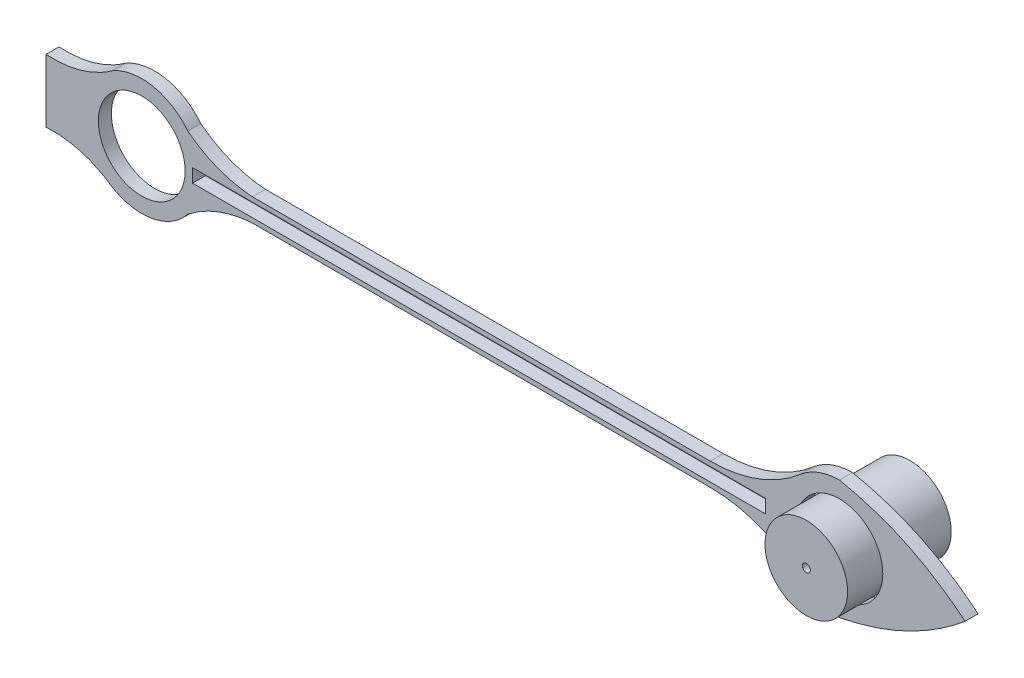
ISO-10303-21;
HEADER;
FILE_DESCRIPTION(('STEP AP214'),'2;1');
FILE_NAME('part.step','',(''),(''),'','','');
FILE_SCHEMA(('AUTOMOTIVE_DESIGN { 1 0 10303 214 1 1 1 1 }'));
ENDSEC;
DATA;
#1=APPLICATION_CONTEXT('core data for automotive mechanical design processes');
#2=APPLICATION_PROTOCOL_DEFINITION('international standard','automotive_design',2000,#1);
#3=PRODUCT_CONTEXT('',#1,'mechanical');
#4=PRODUCT('Part','Part','',(#3));
#5=PRODUCT_RELATED_PRODUCT_CATEGORY('part','',(#4));
#6=PRODUCT_DEFINITION_FORMATION('','',#4);
#7=PRODUCT_DEFINITION_CONTEXT('part definition',#1,'design');
#8=PRODUCT_DEFINITION('design','',#6,#7);
#9=PRODUCT_DEFINITION_SHAPE('','',#8);
#10=(LENGTH_UNIT() NAMED_UNIT(*) SI_UNIT(.MILLI.,.METRE.));
#11=(NAMED_UNIT(*) PLANE_ANGLE_UNIT() SI_UNIT($,.RADIAN.));
#12=(NAMED_UNIT(*) SI_UNIT($,.STERADIAN.) SOLID_ANGLE_UNIT());
#13=UNCERTAINTY_MEASURE_WITH_UNIT(LENGTH_MEASURE(1.E-05),#10,'distance_accuracy_value','');
#14=(GEOMETRIC_REPRESENTATION_CONTEXT(3) GLOBAL_UNCERTAINTY_ASSIGNED_CONTEXT((#13)) GLOBAL_UNIT_ASSIGNED_CONTEXT((#10,
#11,#12)) REPRESENTATION_CONTEXT('',''));
#15=CARTESIAN_POINT('',(0.,0.,0.));
#16=DIRECTION('',(0.,0.,1.));
#17=DIRECTION('',(1.,0.,0.));
#18=AXIS2_PLACEMENT_3D('',#15,#16,#17);
#19=CARTESIAN_POINT('',(10.3411944264889,-0.157435194287058,-0.015));
#20=DIRECTION('',(0.,0.,1.));
#21=DIRECTION('',(1.,0.,0.));
#22=AXIS2_PLACEMENT_3D('',#19,#20,#21);
#23=CYLINDRICAL_SURFACE('',#22,0.571329138616431);
#24=CARTESIAN_POINT('',(10.3411944264889,-0.157435194287058,0.638));
#25=DIRECTION('',(0.,0.,1.));
#26=DIRECTION('',(1.,0.,0.));
#27=AXIS2_PLACEMENT_3D('',#24,#25,#26);
#28=CIRCLE('',#27,0.571329138616431);
#29=CARTESIAN_POINT('',(10.9125235651053,-0.157435194287058,0.638));
#30=VERTEX_POINT('',#29);
#31=EDGE_CURVE('E55',#30,#30,#28,.T.);
#32=ORIENTED_EDGE('',*,*,#31,.F.);
#33=EDGE_LOOP('',(#32));
#34=FACE_BOUND('',#33,.T.);
#35=CARTESIAN_POINT('',(10.3411944264889,-0.157435194287058,-0.795));
#36=DIRECTION('',(0.,0.,-1.));
#37=DIRECTION('',(-1.,0.,0.));
#38=AXIS2_PLACEMENT_3D('',#35,#36,#37);
#39=CIRCLE('',#38,0.571329138616431);
#40=CARTESIAN_POINT('',(9.76986528787246,-0.157435194287058,-0.795));
#41=VERTEX_POINT('',#40);
#42=EDGE_CURVE('E63',#41,#41,#39,.T.);
#43=ORIENTED_EDGE('',*,*,#42,.F.);
#44=EDGE_LOOP('',(#43));
#45=FACE_BOUND('',#44,.T.);
#46=ADVANCED_FACE('F49',(#34,#45),#23,.T.);
#47=CARTESIAN_POINT('',(10.3411944264889,-0.157435194287058,-0.015));
#48=DIRECTION('',(0.,0.,1.));
#49=DIRECTION('',(1.,0.,0.));
#50=AXIS2_PLACEMENT_3D('',#47,#48,#49);
#51=PLANE('',#50);
#52=CARTESIAN_POINT('',(10.3411944264889,-0.157435194287058,-0.015));
#53=DIRECTION('',(0.,0.,-1.));
#54=DIRECTION('',(-1.,0.,0.));
#55=AXIS2_PLACEMENT_3D('',#52,#53,#54);
#56=CIRCLE('',#55,0.0821846661214865);
#57=CARTESIAN_POINT('',(10.2590097603674,-0.157435194287058,-0.015));
#58=VERTEX_POINT('',#57);
#59=EDGE_CURVE('E69',#58,#58,#56,.T.);
#60=ORIENTED_EDGE('',*,*,#59,.T.);
#61=EDGE_LOOP('',(#60));
#62=FACE_BOUND('',#61,.T.);
#63=CARTESIAN_POINT('',(10.3411944264889,-0.157435194287058,-0.015));
#64=DIRECTION('',(0.,0.,1.));
#65=DIRECTION('',(1.,0.,0.));
#66=AXIS2_PLACEMENT_3D('',#63,#64,#65);
#67=CIRCLE('',#66,0.0555002236042479);
#68=CARTESIAN_POINT('',(10.3966946500931,-0.157435194287058,-0.015));
#69=VERTEX_POINT('',#68);
#70=EDGE_CURVE('E11',#69,#69,#67,.T.);
#71=ORIENTED_EDGE('',*,*,#70,.T.);
#72=EDGE_LOOP('',(#71));
#73=FACE_BOUND('',#72,.T.);
#74=ADVANCED_FACE('F91',(#62,#73),#51,.F.);
#75=CARTESIAN_POINT('',(10.3411944264889,-0.157435194287058,-0.015));
#76=DIRECTION('',(0.,0.,1.));
#77=DIRECTION('',(1.,0.,0.));
#78=AXIS2_PLACEMENT_3D('',#75,#76,#77);
#79=CYLINDRICAL_SURFACE('',#78,0.0555002236042479);
#80=ORIENTED_EDGE('',*,*,#70,.F.);
#81=EDGE_LOOP('',(#80));
#82=FACE_BOUND('',#81,.T.);
#83=CARTESIAN_POINT('',(10.3411944264889,-0.157435194287058,0.638));
#84=DIRECTION('',(0.,0.,1.));
#85=DIRECTION('',(1.,0.,0.));
#86=AXIS2_PLACEMENT_3D('',#83,#84,#85);
#87=CIRCLE('',#86,0.0555002236042479);
#88=CARTESIAN_POINT('',(10.3966946500931,-0.157435194287058,0.638));
#89=VERTEX_POINT('',#88);
#90=EDGE_CURVE('E59',#89,#89,#87,.T.);
#91=ORIENTED_EDGE('',*,*,#90,.T.);
#92=EDGE_LOOP('',(#91));
#93=FACE_BOUND('',#92,.T.);
#94=ADVANCED_FACE('F88',(#82,#93),#79,.F.);
#95=CARTESIAN_POINT('',(10.3411944264889,-0.157435194287058,0.638));
#96=DIRECTION('',(0.,0.,1.));
#97=DIRECTION('',(1.,0.,0.));
#98=AXIS2_PLACEMENT_3D('',#95,#96,#97);
#99=PLANE('',#98);
#100=ORIENTED_EDGE('',*,*,#31,.T.);
#101=EDGE_LOOP('',(#100));
#102=FACE_BOUND('',#101,.T.);
#103=ORIENTED_EDGE('',*,*,#90,.F.);
#104=EDGE_LOOP('',(#103));
#105=FACE_BOUND('',#104,.T.);
#106=ADVANCED_FACE('F80',(#102,#105),#99,.T.);
#107=CARTESIAN_POINT('',(10.3411944264889,-0.157435194287058,-0.795));
#108=DIRECTION('',(0.,0.,-1.));
#109=DIRECTION('',(-1.,0.,0.));
#110=AXIS2_PLACEMENT_3D('',#107,#108,#109);
#111=PLANE('',#110);
#112=ORIENTED_EDGE('',*,*,#42,.T.);
#113=EDGE_LOOP('',(#112));
#114=FACE_BOUND('',#113,.T.);
#115=CARTESIAN_POINT('',(10.3411944264889,-0.157435194287058,-0.795));
#116=DIRECTION('',(0.,0.,-1.));
#117=DIRECTION('',(-1.,0.,0.));
#118=AXIS2_PLACEMENT_3D('',#115,#116,#117);
#119=CIRCLE('',#118,0.0821846661214865);
#120=CARTESIAN_POINT('',(10.2590097603674,-0.157435194287058,-0.795));
#121=VERTEX_POINT('',#120);
#122=EDGE_CURVE('E68',#121,#121,#119,.T.);
#123=ORIENTED_EDGE('',*,*,#122,.F.);
#124=EDGE_LOOP('',(#123));
#125=FACE_BOUND('',#124,.T.);
#126=ADVANCED_FACE('F78',(#114,#125),#111,.T.);
#127=CARTESIAN_POINT('',(10.3411944264889,-0.157435194287058,-0.795));
#128=DIRECTION('',(0.,0.,1.));
#129=DIRECTION('',(1.,0.,0.));
#130=AXIS2_PLACEMENT_3D('',#127,#128,#129);
#131=CYLINDRICAL_SURFACE('',#130,0.0821846661214865);
#132=ORIENTED_EDGE('',*,*,#122,.T.);
#133=EDGE_LOOP('',(#132));
#134=FACE_BOUND('',#133,.T.);
#135=ORIENTED_EDGE('',*,*,#59,.F.);
#136=EDGE_LOOP('',(#135));
#137=FACE_BOUND('',#136,.T.);
#138=ADVANCED_FACE('F75',(#134,#137),#131,.F.);
#139=CLOSED_SHELL('',(#46,#74,#94,#106,#126,#138));
#140=MANIFOLD_SOLID_BREP('B2',#139);
#141=CARTESIAN_POINT('',(0.692740720311291,-0.157435194287058,0.18));
#142=DIRECTION('',(0.,0.,-1.));
#143=DIRECTION('',(-1.,0.,0.));
#144=AXIS2_PLACEMENT_3D('',#141,#142,#143);
#145=CYLINDRICAL_SURFACE('',#144,0.808582210206867);
#146=CARTESIAN_POINT('',(0.692740720311291,-0.157435194287058,0.));
#147=DIRECTION('',(0.,0.,1.));
#148=DIRECTION('',(1.,0.,0.));
#149=AXIS2_PLACEMENT_3D('',#146,#147,#148);
#150=CIRCLE('',#149,0.808582210206867);
#151=CARTESIAN_POINT('',(0.292489664377276,-0.860004965118915,0.));
#152=VERTEX_POINT('',#151);
#153=CARTESIAN_POINT('',(1.33084956443728,-0.654046001369646,0.));
#154=VERTEX_POINT('',#153);
#155=EDGE_CURVE('E361',#152,#154,#150,.T.);
#156=ORIENTED_EDGE('',*,*,#155,.T.);
#157=DIRECTION('',(0.,0.,-1.));
#158=VECTOR('',#157,1.);
#159=CARTESIAN_POINT('',(1.33084956443728,-0.654046001369646,0.18));
#160=LINE('',#159,#158);
#161=CARTESIAN_POINT('',(1.33084956443728,-0.654046001369646,0.18));
#162=VERTEX_POINT('',#161);
#163=EDGE_CURVE('E47',#162,#154,#160,.T.);
#164=ORIENTED_EDGE('',*,*,#163,.F.);
#165=CARTESIAN_POINT('',(0.692740720311291,-0.157435194287058,0.18));
#166=DIRECTION('',(0.,0.,1.));
#167=DIRECTION('',(1.,0.,0.));
#168=AXIS2_PLACEMENT_3D('',#165,#166,#167);
#169=CIRCLE('',#168,0.808582210206867);
#170=CARTESIAN_POINT('',(0.292489664377276,-0.860004965118915,0.18));
#171=VERTEX_POINT('',#170);
#172=EDGE_CURVE('E319',#171,#162,#169,.T.);
#173=ORIENTED_EDGE('',*,*,#172,.F.);
#174=DIRECTION('',(0.,0.,-1.));
#175=VECTOR('',#174,1.);
#176=CARTESIAN_POINT('',(0.292489664377276,-0.860004965118915,0.18));
#177=LINE('',#176,#175);
#178=EDGE_CURVE('E433',#171,#152,#177,.T.);
#179=ORIENTED_EDGE('',*,*,#178,.T.);
#180=EDGE_LOOP('',(#156,#164,#173,#179));
#181=FACE_BOUND('',#180,.T.);
#182=ADVANCED_FACE('F144',(#181),#145,.T.);
#183=CARTESIAN_POINT('',(1.33084956443728,-0.654046001369645,0.18));
#184=CARTESIAN_POINT('',(1.72182390763372,-0.349562315111604,0.18));
#185=CARTESIAN_POINT('',(2.22369938661582,-0.314870388574118,0.18));
#186=B_SPLINE_CURVE_WITH_KNOTS('',2,(#183,#184,#185),.UNSPECIFIED.,.F.,.F.,(3,3),(0.,1.),.UNSPECIFIED.);
#187=DIRECTION('',(0.,0.,-1.));
#188=VECTOR('',#187,1.);
#189=SURFACE_OF_LINEAR_EXTRUSION('',#186,#188);
#190=CARTESIAN_POINT('',(1.33084956443728,-0.654046001369645,0.));
#191=CARTESIAN_POINT('',(1.72182390763372,-0.349562315111604,0.));
#192=CARTESIAN_POINT('',(2.22369938661582,-0.314870388574118,0.));
#193=B_SPLINE_CURVE_WITH_KNOTS('',2,(#190,#191,#192),.UNSPECIFIED.,.F.,.F.,(3,3),(0.,1.),.UNSPECIFIED.);
#194=CARTESIAN_POINT('',(2.22369938661582,-0.314870388574117,0.));
#195=VERTEX_POINT('',#194);
#196=EDGE_CURVE('E364',#154,#195,#193,.T.);
#197=ORIENTED_EDGE('',*,*,#196,.T.);
#198=DIRECTION('',(0.,0.,-1.));
#199=VECTOR('',#198,1.);
#200=CARTESIAN_POINT('',(2.22369938661582,-0.314870388574117,0.18));
#201=LINE('',#200,#199);
#202=CARTESIAN_POINT('',(2.22369938661582,-0.314870388574117,0.18));
#203=VERTEX_POINT('',#202);
#204=EDGE_CURVE('E152',#203,#195,#201,.T.);
#205=ORIENTED_EDGE('',*,*,#204,.F.);
#206=EDGE_CURVE('E322',#162,#203,#186,.T.);
#207=ORIENTED_EDGE('',*,*,#206,.F.);
#208=ORIENTED_EDGE('',*,*,#163,.T.);
#209=EDGE_LOOP('',(#197,#205,#207,#208));
#210=FACE_BOUND('',#209,.T.);
#211=ADVANCED_FACE('F333',(#210),#189,.F.);
#212=CARTESIAN_POINT('',(5.75333684182312,-0.314870388574116,0.18));
#213=DIRECTION('',(0.,-1.,0.));
#214=DIRECTION('',(1.,0.,0.));
#215=AXIS2_PLACEMENT_3D('',#212,#213,#214);
#216=PLANE('',#215);
#217=DIRECTION('',(-1.,0.,0.));
#218=VECTOR('',#217,1.);
#219=CARTESIAN_POINT('',(5.75333684182312,-0.314870388574116,0.));
#220=LINE('',#219,#218);
#221=CARTESIAN_POINT('',(8.55584823734783,-0.314870388574115,0.));
#222=VERTEX_POINT('',#221);
#223=EDGE_CURVE('E374',#222,#195,#220,.T.);
#224=ORIENTED_EDGE('',*,*,#223,.F.);
#225=DIRECTION('',(0.,0.,-1.));
#226=VECTOR('',#225,1.);
#227=CARTESIAN_POINT('',(8.55584823734783,-0.314870388574115,0.18));
#228=LINE('',#227,#226);
#229=CARTESIAN_POINT('',(8.55584823734783,-0.314870388574115,0.18));
#230=VERTEX_POINT('',#229);
#231=EDGE_CURVE('E465',#230,#222,#228,.T.);
#232=ORIENTED_EDGE('',*,*,#231,.F.);
#233=DIRECTION('',(-1.,0.,0.));
#234=VECTOR('',#233,1.);
#235=CARTESIAN_POINT('',(5.75333684182312,-0.314870388574116,0.18));
#236=LINE('',#235,#234);
#237=EDGE_CURVE('E327',#230,#203,#236,.T.);
#238=ORIENTED_EDGE('',*,*,#237,.T.);
#239=ORIENTED_EDGE('',*,*,#204,.T.);
#240=EDGE_LOOP('',(#224,#232,#238,#239));
#241=FACE_BOUND('',#240,.T.);
#242=ADVANCED_FACE('F337',(#241),#216,.T.);
#243=CARTESIAN_POINT('',(8.55584823734783,-2.21487038857412,0.18));
#244=DIRECTION('',(0.,0.,-1.));
#245=DIRECTION('',(-1.,0.,0.));
#246=AXIS2_PLACEMENT_3D('',#243,#244,#245);
#247=CYLINDRICAL_SURFACE('',#246,1.9);
#248=CARTESIAN_POINT('',(8.55584823734783,-2.21487038857412,0.));
#249=DIRECTION('',(0.,0.,1.));
#250=DIRECTION('',(1.,0.,0.));
#251=AXIS2_PLACEMENT_3D('',#248,#249,#250);
#252=CIRCLE('',#251,1.9);
#253=CARTESIAN_POINT('',(9.80110652194742,-0.779833174897734,0.));
#254=VERTEX_POINT('',#253);
#255=EDGE_CURVE('E380',#254,#222,#252,.T.);
#256=ORIENTED_EDGE('',*,*,#255,.F.);
#257=DIRECTION('',(0.,0.,-1.));
#258=VECTOR('',#257,1.);
#259=CARTESIAN_POINT('',(9.80110652194742,-0.779833174897734,0.18));
#260=LINE('',#259,#258);
#261=CARTESIAN_POINT('',(9.80110652194742,-0.779833174897734,0.18));
#262=VERTEX_POINT('',#261);
#263=EDGE_CURVE('E463',#262,#254,#260,.T.);
#264=ORIENTED_EDGE('',*,*,#263,.F.);
#265=CARTESIAN_POINT('',(8.55584823734783,-2.21487038857412,0.18));
#266=DIRECTION('',(0.,0.,1.));
#267=DIRECTION('',(1.,0.,0.));
#268=AXIS2_PLACEMENT_3D('',#265,#266,#267);
#269=CIRCLE('',#268,1.9);
#270=EDGE_CURVE('E482',#262,#230,#269,.T.);
#271=ORIENTED_EDGE('',*,*,#270,.T.);
#272=ORIENTED_EDGE('',*,*,#231,.T.);
#273=EDGE_LOOP('',(#256,#264,#271,#272));
#274=FACE_BOUND('',#273,.T.);
#275=ADVANCED_FACE('F478',(#274),#247,.F.);
#276=CARTESIAN_POINT('',(10.3411944264889,-0.157435194287058,0.18));
#277=DIRECTION('',(0.,0.,-1.));
#278=DIRECTION('',(-1.,0.,0.));
#279=AXIS2_PLACEMENT_3D('',#276,#277,#278);
#280=CYLINDRICAL_SURFACE('',#279,0.824059579702972);
#281=CARTESIAN_POINT('',(10.3411944264889,-0.157435194287058,0.));
#282=DIRECTION('',(0.,0.,1.));
#283=DIRECTION('',(1.,0.,0.));
#284=AXIS2_PLACEMENT_3D('',#281,#282,#283);
#285=CIRCLE('',#284,0.824059579702972);
#286=CARTESIAN_POINT('',(10.3411944264889,-0.98149477399003,0.));
#287=VERTEX_POINT('',#286);
#288=EDGE_CURVE('E383',#254,#287,#285,.T.);
#289=ORIENTED_EDGE('',*,*,#288,.T.);
#290=DIRECTION('',(0.,0.,-1.));
#291=VECTOR('',#290,1.);
#292=CARTESIAN_POINT('',(10.3411944264889,-0.98149477399003,0.18));
#293=LINE('',#292,#291);
#294=CARTESIAN_POINT('',(10.3411944264889,-0.98149477399003,0.18));
#295=VERTEX_POINT('',#294);
#296=EDGE_CURVE('E460',#295,#287,#293,.T.);
#297=ORIENTED_EDGE('',*,*,#296,.F.);
#298=CARTESIAN_POINT('',(10.3411944264889,-0.157435194287058,0.18));
#299=DIRECTION('',(0.,0.,1.));
#300=DIRECTION('',(1.,0.,0.));
#301=AXIS2_PLACEMENT_3D('',#298,#299,#300);
#302=CIRCLE('',#301,0.824059579702972);
#303=EDGE_CURVE('E485',#262,#295,#302,.T.);
#304=ORIENTED_EDGE('',*,*,#303,.F.);
#305=ORIENTED_EDGE('',*,*,#263,.T.);
#306=EDGE_LOOP('',(#289,#297,#304,#305));
#307=FACE_BOUND('',#306,.T.);
#308=ADVANCED_FACE('F507',(#307),#280,.T.);
#309=CARTESIAN_POINT('',(10.3411944264889,-0.98149477399003,0.18));
#310=CARTESIAN_POINT('',(11.3300371086183,-0.786660904355301,0.18));
#311=CARTESIAN_POINT('',(12.0777844314337,-0.157435194287059,0.18));
#312=B_SPLINE_CURVE_WITH_KNOTS('',2,(#309,#310,#311),.UNSPECIFIED.,.F.,.F.,(3,3),(0.,1.),.UNSPECIFIED.);
#313=DIRECTION('',(0.,0.,-1.));
#314=VECTOR('',#313,1.);
#315=SURFACE_OF_LINEAR_EXTRUSION('',#312,#314);
#316=CARTESIAN_POINT('',(10.3411944264889,-0.98149477399003,0.));
#317=CARTESIAN_POINT('',(11.3300371086183,-0.786660904355301,0.));
#318=CARTESIAN_POINT('',(12.0777844314337,-0.157435194287059,0.));
#319=B_SPLINE_CURVE_WITH_KNOTS('',2,(#316,#317,#318),.UNSPECIFIED.,.F.,.F.,(3,3),(0.,1.),.UNSPECIFIED.);
#320=CARTESIAN_POINT('',(12.0777844314337,-0.157435194287059,0.));
#321=VERTEX_POINT('',#320);
#322=EDGE_CURVE('E385',#287,#321,#319,.T.);
#323=ORIENTED_EDGE('',*,*,#322,.T.);
#324=DIRECTION('',(0.,0.,-1.));
#325=VECTOR('',#324,1.);
#326=CARTESIAN_POINT('',(12.0777844314337,-0.157435194287059,0.18));
#327=LINE('',#326,#325);
#328=CARTESIAN_POINT('',(12.0777844314337,-0.157435194287059,0.18));
#329=VERTEX_POINT('',#328);
#330=EDGE_CURVE('E458',#329,#321,#327,.T.);
#331=ORIENTED_EDGE('',*,*,#330,.F.);
#332=EDGE_CURVE('E486',#295,#329,#312,.T.);
#333=ORIENTED_EDGE('',*,*,#332,.F.);
#334=ORIENTED_EDGE('',*,*,#296,.T.);
#335=EDGE_LOOP('',(#323,#331,#333,#334));
#336=FACE_BOUND('',#335,.T.);
#337=ADVANCED_FACE('F502',(#336),#315,.F.);
#338=CARTESIAN_POINT('',(10.3411944264889,0.666624385415912,0.18));
#339=CARTESIAN_POINT('',(11.3300371086183,0.471790515781183,0.18));
#340=CARTESIAN_POINT('',(12.0777844314337,-0.157435194287059,0.18));
#341=B_SPLINE_CURVE_WITH_KNOTS('',2,(#338,#339,#340),.UNSPECIFIED.,.F.,.F.,(3,3),(0.,1.),.UNSPECIFIED.);
#342=DIRECTION('',(0.,0.,-1.));
#343=VECTOR('',#342,1.);
#344=SURFACE_OF_LINEAR_EXTRUSION('',#341,#343);
#345=CARTESIAN_POINT('',(10.3411944264889,0.666624385415912,0.));
#346=CARTESIAN_POINT('',(11.3300371086183,0.471790515781183,0.));
#347=CARTESIAN_POINT('',(12.0777844314337,-0.157435194287059,0.));
#348=B_SPLINE_CURVE_WITH_KNOTS('',2,(#345,#346,#347),.UNSPECIFIED.,.F.,.F.,(3,3),(0.,1.),.UNSPECIFIED.);
#349=CARTESIAN_POINT('',(10.3411944264889,0.666624385415914,0.));
#350=VERTEX_POINT('',#349);
#351=EDGE_CURVE('E390',#350,#321,#348,.T.);
#352=ORIENTED_EDGE('',*,*,#351,.F.);
#353=DIRECTION('',(0.,0.,-1.));
#354=VECTOR('',#353,1.);
#355=CARTESIAN_POINT('',(10.3411944264889,0.666624385415914,0.18));
#356=LINE('',#355,#354);
#357=CARTESIAN_POINT('',(10.3411944264889,0.666624385415914,0.18));
#358=VERTEX_POINT('',#357);
#359=EDGE_CURVE('E456',#358,#350,#356,.T.);
#360=ORIENTED_EDGE('',*,*,#359,.F.);
#361=EDGE_CURVE('E493',#358,#329,#341,.T.);
#362=ORIENTED_EDGE('',*,*,#361,.T.);
#363=ORIENTED_EDGE('',*,*,#330,.T.);
#364=EDGE_LOOP('',(#352,#360,#362,#363));
#365=FACE_BOUND('',#364,.T.);
#366=ADVANCED_FACE('F506',(#365),#344,.T.);
#367=CARTESIAN_POINT('',(10.3411944264889,-0.157435194287058,0.18));
#368=DIRECTION('',(0.,0.,-1.));
#369=DIRECTION('',(-1.,0.,0.));
#370=AXIS2_PLACEMENT_3D('',#367,#368,#369);
#371=CYLINDRICAL_SURFACE('',#370,0.824059579702972);
#372=CARTESIAN_POINT('',(10.3411944264889,-0.157435194287058,0.));
#373=DIRECTION('',(0.,0.,1.));
#374=DIRECTION('',(1.,0.,0.));
#375=AXIS2_PLACEMENT_3D('',#372,#373,#374);
#376=CIRCLE('',#375,0.824059579702972);
#377=CARTESIAN_POINT('',(9.80110652194742,0.464962786323618,0.));
#378=VERTEX_POINT('',#377);
#379=EDGE_CURVE('E398',#350,#378,#376,.T.);
#380=ORIENTED_EDGE('',*,*,#379,.T.);
#381=DIRECTION('',(0.,0.,-1.));
#382=VECTOR('',#381,1.);
#383=CARTESIAN_POINT('',(9.80110652194742,0.464962786323618,0.18));
#384=LINE('',#383,#382);
#385=CARTESIAN_POINT('',(9.80110652194742,0.464962786323618,0.18));
#386=VERTEX_POINT('',#385);
#387=EDGE_CURVE('E453',#386,#378,#384,.T.);
#388=ORIENTED_EDGE('',*,*,#387,.F.);
#389=CARTESIAN_POINT('',(10.3411944264889,-0.157435194287058,0.18));
#390=DIRECTION('',(0.,0.,1.));
#391=DIRECTION('',(1.,0.,0.));
#392=AXIS2_PLACEMENT_3D('',#389,#390,#391);
#393=CIRCLE('',#392,0.824059579702972);
#394=EDGE_CURVE('E716',#358,#386,#393,.T.);
#395=ORIENTED_EDGE('',*,*,#394,.F.);
#396=ORIENTED_EDGE('',*,*,#359,.T.);
#397=EDGE_LOOP('',(#380,#388,#395,#396));
#398=FACE_BOUND('',#397,.T.);
#399=ADVANCED_FACE('F554',(#398),#371,.T.);
#400=CARTESIAN_POINT('',(8.55584823734783,1.9,0.18));
#401=DIRECTION('',(0.,0.,-1.));
#402=DIRECTION('',(-1.,0.,0.));
#403=AXIS2_PLACEMENT_3D('',#400,#401,#402);
#404=CYLINDRICAL_SURFACE('',#403,1.9);
#405=CARTESIAN_POINT('',(8.55584823734783,1.9,0.));
#406=DIRECTION('',(0.,0.,1.));
#407=DIRECTION('',(1.,0.,0.));
#408=AXIS2_PLACEMENT_3D('',#405,#406,#407);
#409=CIRCLE('',#408,1.9);
#410=CARTESIAN_POINT('',(8.55584823734783,0.,0.));
#411=VERTEX_POINT('',#410);
#412=EDGE_CURVE('E403',#378,#411,#409,.F.);
#413=ORIENTED_EDGE('',*,*,#412,.T.);
#414=DIRECTION('',(0.,0.,-1.));
#415=VECTOR('',#414,1.);
#416=CARTESIAN_POINT('',(8.55584823734783,0.,0.18));
#417=LINE('',#416,#415);
#418=CARTESIAN_POINT('',(8.55584823734783,0.,0.18));
#419=VERTEX_POINT('',#418);
#420=EDGE_CURVE('E451',#419,#411,#417,.T.);
#421=ORIENTED_EDGE('',*,*,#420,.F.);
#422=CARTESIAN_POINT('',(8.55584823734783,1.9,0.18));
#423=DIRECTION('',(0.,0.,1.));
#424=DIRECTION('',(1.,0.,0.));
#425=AXIS2_PLACEMENT_3D('',#422,#423,#424);
#426=CIRCLE('',#425,1.9);
#427=EDGE_CURVE('E715',#386,#419,#426,.F.);
#428=ORIENTED_EDGE('',*,*,#427,.F.);
#429=ORIENTED_EDGE('',*,*,#387,.T.);
#430=EDGE_LOOP('',(#413,#421,#428,#429));
#431=FACE_BOUND('',#430,.T.);
#432=ADVANCED_FACE('F562',(#431),#404,.F.);
#433=CARTESIAN_POINT('',(5.75333684182312,0.,0.18));
#434=DIRECTION('',(0.,1.,0.));
#435=DIRECTION('',(0.,0.,1.));
#436=AXIS2_PLACEMENT_3D('',#433,#434,#435);
#437=PLANE('',#436);
#438=DIRECTION('',(1.,0.,0.));
#439=VECTOR('',#438,1.);
#440=CARTESIAN_POINT('',(5.75333684182312,0.,0.));
#441=LINE('',#440,#439);
#442=CARTESIAN_POINT('',(2.22369938661582,0.,0.));
#443=VERTEX_POINT('',#442);
#444=EDGE_CURVE('E406',#443,#411,#441,.T.);
#445=ORIENTED_EDGE('',*,*,#444,.F.);
#446=DIRECTION('',(0.,0.,-1.));
#447=VECTOR('',#446,1.);
#448=CARTESIAN_POINT('',(2.22369938661582,0.,0.18));
#449=LINE('',#448,#447);
#450=CARTESIAN_POINT('',(2.22369938661582,0.,0.18));
#451=VERTEX_POINT('',#450);
#452=EDGE_CURVE('E449',#451,#443,#449,.T.);
#453=ORIENTED_EDGE('',*,*,#452,.F.);
#454=DIRECTION('',(1.,0.,0.));
#455=VECTOR('',#454,1.);
#456=CARTESIAN_POINT('',(5.75333684182312,0.,0.18));
#457=LINE('',#456,#455);
#458=EDGE_CURVE('E709',#451,#419,#457,.T.);
#459=ORIENTED_EDGE('',*,*,#458,.T.);
#460=ORIENTED_EDGE('',*,*,#420,.T.);
#461=EDGE_LOOP('',(#445,#453,#459,#460));
#462=FACE_BOUND('',#461,.T.);
#463=ADVANCED_FACE('F570',(#462),#437,.T.);
#464=CARTESIAN_POINT('',(1.33084956443728,0.339175612795525,0.18));
#465=CARTESIAN_POINT('',(1.72182390763372,0.0346919265374838,0.18));
#466=CARTESIAN_POINT('',(2.22369938661582,0.,0.18));
#467=B_SPLINE_CURVE_WITH_KNOTS('',2,(#464,#465,#466),.UNSPECIFIED.,.F.,.F.,(3,3),(0.,1.),.UNSPECIFIED.);
#468=DIRECTION('',(0.,0.,-1.));
#469=VECTOR('',#468,1.);
#470=SURFACE_OF_LINEAR_EXTRUSION('',#467,#469);
#471=CARTESIAN_POINT('',(1.33084956443728,0.339175612795525,0.));
#472=CARTESIAN_POINT('',(1.72182390763372,0.0346919265374838,0.));
#473=CARTESIAN_POINT('',(2.22369938661582,0.,0.));
#474=B_SPLINE_CURVE_WITH_KNOTS('',2,(#471,#472,#473),.UNSPECIFIED.,.F.,.F.,(3,3),(0.,1.),.UNSPECIFIED.);
#475=CARTESIAN_POINT('',(1.33084956443728,0.339175612795527,0.));
#476=VERTEX_POINT('',#475);
#477=EDGE_CURVE('E409',#476,#443,#474,.T.);
#478=ORIENTED_EDGE('',*,*,#477,.F.);
#479=DIRECTION('',(0.,0.,-1.));
#480=VECTOR('',#479,1.);
#481=CARTESIAN_POINT('',(1.33084956443728,0.339175612795527,0.18));
#482=LINE('',#481,#480);
#483=CARTESIAN_POINT('',(1.33084956443728,0.339175612795527,0.18));
#484=VERTEX_POINT('',#483);
#485=EDGE_CURVE('E447',#484,#476,#482,.T.);
#486=ORIENTED_EDGE('',*,*,#485,.F.);
#487=EDGE_CURVE('E703',#484,#451,#467,.T.);
#488=ORIENTED_EDGE('',*,*,#487,.T.);
#489=ORIENTED_EDGE('',*,*,#452,.T.);
#490=EDGE_LOOP('',(#478,#486,#488,#489));
#491=FACE_BOUND('',#490,.T.);
#492=ADVANCED_FACE('F579',(#491),#470,.T.);
#493=CARTESIAN_POINT('',(0.692740720311291,-0.157435194287058,0.18));
#494=DIRECTION('',(0.,0.,-1.));
#495=DIRECTION('',(-1.,0.,0.));
#496=AXIS2_PLACEMENT_3D('',#493,#494,#495);
#497=CYLINDRICAL_SURFACE('',#496,0.808582210206865);
#498=CARTESIAN_POINT('',(0.692740720311291,-0.157435194287058,0.));
#499=DIRECTION('',(0.,0.,1.));
#500=DIRECTION('',(1.,0.,0.));
#501=AXIS2_PLACEMENT_3D('',#498,#499,#500);
#502=CIRCLE('',#501,0.808582210206865);
#503=CARTESIAN_POINT('',(0.292489664377276,0.545134576544797,0.));
#504=VERTEX_POINT('',#503);
#505=EDGE_CURVE('E414',#476,#504,#502,.T.);
#506=ORIENTED_EDGE('',*,*,#505,.T.);
#507=DIRECTION('',(0.,0.,-1.));
#508=VECTOR('',#507,1.);
#509=CARTESIAN_POINT('',(0.292489664377276,0.545134576544797,0.18));
#510=LINE('',#509,#508);
#511=CARTESIAN_POINT('',(0.292489664377276,0.545134576544797,0.18));
#512=VERTEX_POINT('',#511);
#513=EDGE_CURVE('E445',#512,#504,#510,.T.);
#514=ORIENTED_EDGE('',*,*,#513,.F.);
#515=CARTESIAN_POINT('',(0.692740720311291,-0.157435194287058,0.18));
#516=DIRECTION('',(0.,0.,1.));
#517=DIRECTION('',(1.,0.,0.));
#518=AXIS2_PLACEMENT_3D('',#515,#516,#517);
#519=CIRCLE('',#518,0.808582210206865);
#520=EDGE_CURVE('E698',#484,#512,#519,.T.);
#521=ORIENTED_EDGE('',*,*,#520,.F.);
#522=ORIENTED_EDGE('',*,*,#485,.T.);
#523=EDGE_LOOP('',(#506,#514,#521,#522));
#524=FACE_BOUND('',#523,.T.);
#525=ADVANCED_FACE('F588',(#524),#497,.T.);
#526=CARTESIAN_POINT('',(-0.631189967566498,0.278247346649628,0.18));
#527=CARTESIAN_POINT('',(-0.120424131877403,0.249171990195551,0.18));
#528=CARTESIAN_POINT('',(0.292489664377276,0.545134576544795,0.18));
#529=B_SPLINE_CURVE_WITH_KNOTS('',2,(#526,#527,#528),.UNSPECIFIED.,.F.,.F.,(3,3),(0.,1.),.UNSPECIFIED.);
#530=DIRECTION('',(0.,0.,-1.));
#531=VECTOR('',#530,1.);
#532=SURFACE_OF_LINEAR_EXTRUSION('',#529,#531);
#533=CARTESIAN_POINT('',(-0.631189967566498,0.278247346649628,0.));
#534=CARTESIAN_POINT('',(-0.120424131877403,0.249171990195551,0.));
#535=CARTESIAN_POINT('',(0.292489664377276,0.545134576544795,0.));
#536=B_SPLINE_CURVE_WITH_KNOTS('',2,(#533,#534,#535),.UNSPECIFIED.,.F.,.F.,(3,3),(0.,1.),.UNSPECIFIED.);
#537=CARTESIAN_POINT('',(-0.631189967566498,0.27824734664963,0.));
#538=VERTEX_POINT('',#537);
#539=EDGE_CURVE('E420',#538,#504,#536,.T.);
#540=ORIENTED_EDGE('',*,*,#539,.F.);
#541=DIRECTION('',(0.,0.,-1.));
#542=VECTOR('',#541,1.);
#543=CARTESIAN_POINT('',(-0.631189967566498,0.27824734664963,0.18));
#544=LINE('',#543,#542);
#545=CARTESIAN_POINT('',(-0.631189967566498,0.27824734664963,0.18));
#546=VERTEX_POINT('',#545);
#547=EDGE_CURVE('E443',#546,#538,#544,.T.);
#548=ORIENTED_EDGE('',*,*,#547,.F.);
#549=EDGE_CURVE('E692',#546,#512,#529,.T.);
#550=ORIENTED_EDGE('',*,*,#549,.T.);
#551=ORIENTED_EDGE('',*,*,#513,.T.);
#552=EDGE_LOOP('',(#540,#548,#550,#551));
#553=FACE_BOUND('',#552,.T.);
#554=ADVANCED_FACE('F352',(#553),#532,.T.);
#555=CARTESIAN_POINT('',(-0.631189967566498,-10.2700611681301,0.18));
#556=DIRECTION('',(1.,0.,0.));
#557=DIRECTION('',(0.,0.,-1.));
#558=AXIS2_PLACEMENT_3D('',#555,#556,#557);
#559=PLANE('',#558);
#560=DIRECTION('',(0.,-1.,0.));
#561=VECTOR('',#560,1.);
#562=CARTESIAN_POINT('',(-0.631189967566498,-10.2700611681301,0.));
#563=LINE('',#562,#561);
#564=CARTESIAN_POINT('',(-0.631189967566498,-0.593117735223749,0.));
#565=VERTEX_POINT('',#564);
#566=EDGE_CURVE('E425',#538,#565,#563,.T.);
#567=ORIENTED_EDGE('',*,*,#566,.T.);
#568=DIRECTION('',(0.,0.,-1.));
#569=VECTOR('',#568,1.);
#570=CARTESIAN_POINT('',(-0.631189967566498,-0.593117735223749,0.18));
#571=LINE('',#570,#569);
#572=CARTESIAN_POINT('',(-0.631189967566498,-0.593117735223749,0.18));
#573=VERTEX_POINT('',#572);
#574=EDGE_CURVE('E439',#573,#565,#571,.T.);
#575=ORIENTED_EDGE('',*,*,#574,.F.);
#576=DIRECTION('',(0.,-1.,0.));
#577=VECTOR('',#576,1.);
#578=CARTESIAN_POINT('',(-0.631189967566498,-10.2700611681301,0.18));
#579=LINE('',#578,#577);
#580=EDGE_CURVE('E687',#546,#573,#579,.T.);
#581=ORIENTED_EDGE('',*,*,#580,.F.);
#582=ORIENTED_EDGE('',*,*,#547,.T.);
#583=EDGE_LOOP('',(#567,#575,#581,#582));
#584=FACE_BOUND('',#583,.T.);
#585=ADVANCED_FACE('F344',(#584),#559,.F.);
#586=CARTESIAN_POINT('',(0.692740720311291,-0.157435194287058,0.18));
#587=DIRECTION('',(0.,0.,-1.));
#588=DIRECTION('',(-1.,0.,0.));
#589=AXIS2_PLACEMENT_3D('',#586,#587,#588);
#590=CYLINDRICAL_SURFACE('',#589,0.6);
#591=CARTESIAN_POINT('',(0.692740720311291,-0.157435194287058,0.18));
#592=DIRECTION('',(0.,0.,1.));
#593=DIRECTION('',(1.,0.,0.));
#594=AXIS2_PLACEMENT_3D('',#591,#592,#593);
#595=CIRCLE('',#594,0.6);
#596=CARTESIAN_POINT('',(1.29274072031129,-0.157435194287058,0.18));
#597=VERTEX_POINT('',#596);
#598=EDGE_CURVE('E315',#597,#597,#595,.T.);
#599=ORIENTED_EDGE('',*,*,#598,.T.);
#600=EDGE_LOOP('',(#599));
#601=FACE_BOUND('',#600,.T.);
#602=CARTESIAN_POINT('',(0.692740720311291,-0.157435194287058,0.));
#603=DIRECTION('',(0.,0.,1.));
#604=DIRECTION('',(1.,0.,0.));
#605=AXIS2_PLACEMENT_3D('',#602,#603,#604);
#606=CIRCLE('',#605,0.6);
#607=CARTESIAN_POINT('',(1.29274072031129,-0.157435194287058,0.));
#608=VERTEX_POINT('',#607);
#609=EDGE_CURVE('E359',#608,#608,#606,.T.);
#610=ORIENTED_EDGE('',*,*,#609,.F.);
#611=EDGE_LOOP('',(#610));
#612=FACE_BOUND('',#611,.T.);
#613=ADVANCED_FACE('F342',(#601,#612),#590,.F.);
#614=CARTESIAN_POINT('',(10.3411944264889,-0.157435194287058,0.18));
#615=DIRECTION('',(0.,0.,-1.));
#616=DIRECTION('',(-1.,0.,0.));
#617=AXIS2_PLACEMENT_3D('',#614,#615,#616);
#618=CYLINDRICAL_SURFACE('',#617,0.6);
#619=CARTESIAN_POINT('',(10.3411944264889,-0.157435194287058,0.18));
#620=DIRECTION('',(0.,0.,1.));
#621=DIRECTION('',(1.,0.,0.));
#622=AXIS2_PLACEMENT_3D('',#619,#620,#621);
#623=CIRCLE('',#622,0.6);
#624=CARTESIAN_POINT('',(10.9411944264889,-0.157435194287058,0.18));
#625=VERTEX_POINT('',#624);
#626=EDGE_CURVE('E312',#625,#625,#623,.T.);
#627=ORIENTED_EDGE('',*,*,#626,.T.);
#628=EDGE_LOOP('',(#627));
#629=FACE_BOUND('',#628,.T.);
#630=CARTESIAN_POINT('',(10.3411944264889,-0.157435194287058,0.));
#631=DIRECTION('',(0.,0.,1.));
#632=DIRECTION('',(1.,0.,0.));
#633=AXIS2_PLACEMENT_3D('',#630,#631,#632);
#634=CIRCLE('',#633,0.6);
#635=CARTESIAN_POINT('',(10.9411944264889,-0.157435194287058,0.));
#636=VERTEX_POINT('',#635);
#637=EDGE_CURVE('E308',#636,#636,#634,.T.);
#638=ORIENTED_EDGE('',*,*,#637,.F.);
#639=EDGE_LOOP('',(#638));
#640=FACE_BOUND('',#639,.T.);
#641=ADVANCED_FACE('F146',(#629,#640),#618,.F.);
#642=CARTESIAN_POINT('',(-0.631189967566498,-0.593117735223748,0.18));
#643=CARTESIAN_POINT('',(-0.120424131877402,-0.564042378769671,0.18));
#644=CARTESIAN_POINT('',(0.292489664377276,-0.860004965118916,0.18));
#645=B_SPLINE_CURVE_WITH_KNOTS('',2,(#642,#643,#644),.UNSPECIFIED.,.F.,.F.,(3,3),(0.,1.),.UNSPECIFIED.);
#646=DIRECTION('',(0.,0.,-1.));
#647=VECTOR('',#646,1.);
#648=SURFACE_OF_LINEAR_EXTRUSION('',#645,#647);
#649=CARTESIAN_POINT('',(-0.631189967566498,-0.593117735223748,0.));
#650=CARTESIAN_POINT('',(-0.120424131877402,-0.564042378769671,0.));
#651=CARTESIAN_POINT('',(0.292489664377276,-0.860004965118916,0.));
#652=B_SPLINE_CURVE_WITH_KNOTS('',2,(#649,#650,#651),.UNSPECIFIED.,.F.,.F.,(3,3),(0.,1.),.UNSPECIFIED.);
#653=EDGE_CURVE('E316',#565,#152,#652,.T.);
#654=ORIENTED_EDGE('',*,*,#653,.T.);
#655=ORIENTED_EDGE('',*,*,#178,.F.);
#656=EDGE_CURVE('E440',#573,#171,#645,.T.);
#657=ORIENTED_EDGE('',*,*,#656,.F.);
#658=ORIENTED_EDGE('',*,*,#574,.T.);
#659=EDGE_LOOP('',(#654,#655,#657,#658));
#660=FACE_BOUND('',#659,.T.);
#661=ADVANCED_FACE('F350',(#660),#648,.F.);
#662=CARTESIAN_POINT('',(5.75333684182312,-10.2700611681301,0.18));
#663=DIRECTION('',(0.,0.,1.));
#664=DIRECTION('',(1.,0.,0.));
#665=AXIS2_PLACEMENT_3D('',#662,#663,#664);
#666=PLANE('',#665);
#667=DIRECTION('',(0.,1.,0.));
#668=VECTOR('',#667,1.);
#669=CARTESIAN_POINT('',(9.32070235226689,-0.250547903190643,0.18));
#670=LINE('',#669,#668);
#671=CARTESIAN_POINT('',(9.32070235226689,-0.250547903190643,0.18));
#672=VERTEX_POINT('',#671);
#673=CARTESIAN_POINT('',(9.32070235226689,-0.0643224853834733,0.18));
#674=VERTEX_POINT('',#673);
#675=EDGE_CURVE('E159',#672,#674,#670,.T.);
#676=ORIENTED_EDGE('',*,*,#675,.F.);
#677=DIRECTION('',(1.,0.,0.));
#678=VECTOR('',#677,1.);
#679=CARTESIAN_POINT('',(1.39549208938923,-0.250547903190643,0.18));
#680=LINE('',#679,#678);
#681=CARTESIAN_POINT('',(1.39549208938923,-0.250547903190643,0.18));
#682=VERTEX_POINT('',#681);
#683=EDGE_CURVE('E293',#682,#672,#680,.T.);
#684=ORIENTED_EDGE('',*,*,#683,.F.);
#685=DIRECTION('',(0.,-1.,0.));
#686=VECTOR('',#685,1.);
#687=CARTESIAN_POINT('',(1.39549208938923,-0.250547903190643,0.18));
#688=LINE('',#687,#686);
#689=CARTESIAN_POINT('',(1.39549208938923,-0.0643224853834727,0.18));
#690=VERTEX_POINT('',#689);
#691=EDGE_CURVE('E296',#690,#682,#688,.T.);
#692=ORIENTED_EDGE('',*,*,#691,.F.);
#693=DIRECTION('',(-1.,0.,0.));
#694=VECTOR('',#693,1.);
#695=CARTESIAN_POINT('',(1.39549208938923,-0.0643224853834727,0.18));
#696=LINE('',#695,#694);
#697=EDGE_CURVE('E302',#674,#690,#696,.T.);
#698=ORIENTED_EDGE('',*,*,#697,.F.);
#699=EDGE_LOOP('',(#676,#684,#692,#698));
#700=FACE_BOUND('',#699,.T.);
#701=ORIENTED_EDGE('',*,*,#626,.F.);
#702=EDGE_LOOP('',(#701));
#703=FACE_BOUND('',#702,.T.);
#704=ORIENTED_EDGE('',*,*,#598,.F.);
#705=EDGE_LOOP('',(#704));
#706=FACE_BOUND('',#705,.T.);
#707=ORIENTED_EDGE('',*,*,#172,.T.);
#708=ORIENTED_EDGE('',*,*,#206,.T.);
#709=ORIENTED_EDGE('',*,*,#237,.F.);
#710=ORIENTED_EDGE('',*,*,#270,.F.);
#711=ORIENTED_EDGE('',*,*,#303,.T.);
#712=ORIENTED_EDGE('',*,*,#332,.T.);
#713=ORIENTED_EDGE('',*,*,#361,.F.);
#714=ORIENTED_EDGE('',*,*,#394,.T.);
#715=ORIENTED_EDGE('',*,*,#427,.T.);
#716=ORIENTED_EDGE('',*,*,#458,.F.);
#717=ORIENTED_EDGE('',*,*,#487,.F.);
#718=ORIENTED_EDGE('',*,*,#520,.T.);
#719=ORIENTED_EDGE('',*,*,#549,.F.);
#720=ORIENTED_EDGE('',*,*,#580,.T.);
#721=ORIENTED_EDGE('',*,*,#656,.T.);
#722=EDGE_LOOP('',(#707,#708,#709,#710,#711,#712,#713,#714,#715,#716,#717,#718,#719,#720,#721));
#723=FACE_BOUND('',#722,.T.);
#724=ADVANCED_FACE('F484',(#700,#703,#706,#723),#666,.T.);
#725=CARTESIAN_POINT('',(5.75333684182312,-10.2700611681301,0.));
#726=DIRECTION('',(0.,0.,1.));
#727=DIRECTION('',(1.,0.,0.));
#728=AXIS2_PLACEMENT_3D('',#725,#726,#727);
#729=PLANE('',#728);
#730=DIRECTION('',(1.,0.,0.));
#731=VECTOR('',#730,1.);
#732=CARTESIAN_POINT('',(1.39549208938923,-0.250547903190643,0.));
#733=LINE('',#732,#731);
#734=CARTESIAN_POINT('',(1.39549208938923,-0.250547903190643,0.));
#735=VERTEX_POINT('',#734);
#736=CARTESIAN_POINT('',(9.32070235226689,-0.250547903190643,0.));
#737=VERTEX_POINT('',#736);
#738=EDGE_CURVE('E283',#735,#737,#733,.T.);
#739=ORIENTED_EDGE('',*,*,#738,.T.);
#740=DIRECTION('',(0.,1.,0.));
#741=VECTOR('',#740,1.);
#742=CARTESIAN_POINT('',(9.32070235226689,-0.250547903190643,0.));
#743=LINE('',#742,#741);
#744=CARTESIAN_POINT('',(9.32070235226689,-0.0643224853834727,0.));
#745=VERTEX_POINT('',#744);
#746=EDGE_CURVE('E277',#737,#745,#743,.T.);
#747=ORIENTED_EDGE('',*,*,#746,.T.);
#748=DIRECTION('',(-1.,0.,0.));
#749=VECTOR('',#748,1.);
#750=CARTESIAN_POINT('',(1.39549208938923,-0.0643224853834727,0.));
#751=LINE('',#750,#749);
#752=CARTESIAN_POINT('',(1.39549208938923,-0.0643224853834733,0.));
#753=VERTEX_POINT('',#752);
#754=EDGE_CURVE('E286',#745,#753,#751,.T.);
#755=ORIENTED_EDGE('',*,*,#754,.T.);
#756=DIRECTION('',(0.,-1.,0.));
#757=VECTOR('',#756,1.);
#758=CARTESIAN_POINT('',(1.39549208938923,-0.250547903190643,0.));
#759=LINE('',#758,#757);
#760=EDGE_CURVE('E167',#753,#735,#759,.T.);
#761=ORIENTED_EDGE('',*,*,#760,.T.);
#762=EDGE_LOOP('',(#739,#747,#755,#761));
#763=FACE_BOUND('',#762,.T.);
#764=ORIENTED_EDGE('',*,*,#637,.T.);
#765=EDGE_LOOP('',(#764));
#766=FACE_BOUND('',#765,.T.);
#767=ORIENTED_EDGE('',*,*,#609,.T.);
#768=EDGE_LOOP('',(#767));
#769=FACE_BOUND('',#768,.T.);
#770=ORIENTED_EDGE('',*,*,#155,.F.);
#771=ORIENTED_EDGE('',*,*,#653,.F.);
#772=ORIENTED_EDGE('',*,*,#566,.F.);
#773=ORIENTED_EDGE('',*,*,#539,.T.);
#774=ORIENTED_EDGE('',*,*,#505,.F.);
#775=ORIENTED_EDGE('',*,*,#477,.T.);
#776=ORIENTED_EDGE('',*,*,#444,.T.);
#777=ORIENTED_EDGE('',*,*,#412,.F.);
#778=ORIENTED_EDGE('',*,*,#379,.F.);
#779=ORIENTED_EDGE('',*,*,#351,.T.);
#780=ORIENTED_EDGE('',*,*,#322,.F.);
#781=ORIENTED_EDGE('',*,*,#288,.F.);
#782=ORIENTED_EDGE('',*,*,#255,.T.);
#783=ORIENTED_EDGE('',*,*,#223,.T.);
#784=ORIENTED_EDGE('',*,*,#196,.F.);
#785=EDGE_LOOP('',(#770,#771,#772,#773,#774,#775,#776,#777,#778,#779,#780,#781,#782,#783,#784));
#786=FACE_BOUND('',#785,.T.);
#787=ADVANCED_FACE('F290',(#763,#766,#769,#786),#729,.F.);
#788=CARTESIAN_POINT('',(9.32070235226689,-0.250547903190643,0.));
#789=DIRECTION('',(1.,0.,0.));
#790=DIRECTION('',(0.,0.,-1.));
#791=AXIS2_PLACEMENT_3D('',#788,#789,#790);
#792=PLANE('',#791);
#793=ORIENTED_EDGE('',*,*,#675,.T.);
#794=DIRECTION('',(0.,0.,1.));
#795=VECTOR('',#794,1.);
#796=CARTESIAN_POINT('',(9.32070235226689,-0.0643224853834727,0.));
#797=LINE('',#796,#795);
#798=EDGE_CURVE('E273',#745,#674,#797,.T.);
#799=ORIENTED_EDGE('',*,*,#798,.F.);
#800=ORIENTED_EDGE('',*,*,#746,.F.);
#801=DIRECTION('',(0.,0.,1.));
#802=VECTOR('',#801,1.);
#803=CARTESIAN_POINT('',(9.32070235226689,-0.250547903190643,0.));
#804=LINE('',#803,#802);
#805=EDGE_CURVE('E306',#737,#672,#804,.T.);
#806=ORIENTED_EDGE('',*,*,#805,.T.);
#807=EDGE_LOOP('',(#793,#799,#800,#806));
#808=FACE_BOUND('',#807,.T.);
#809=ADVANCED_FACE('F275',(#808),#792,.F.);
#810=CARTESIAN_POINT('',(1.39549208938923,-0.250547903190643,0.));
#811=DIRECTION('',(0.,-1.,0.));
#812=DIRECTION('',(0.,0.,-1.));
#813=AXIS2_PLACEMENT_3D('',#810,#811,#812);
#814=PLANE('',#813);
#815=ORIENTED_EDGE('',*,*,#683,.T.);
#816=ORIENTED_EDGE('',*,*,#805,.F.);
#817=ORIENTED_EDGE('',*,*,#738,.F.);
#818=DIRECTION('',(0.,0.,1.));
#819=VECTOR('',#818,1.);
#820=CARTESIAN_POINT('',(1.39549208938923,-0.250547903190643,0.));
#821=LINE('',#820,#819);
#822=EDGE_CURVE('E309',#735,#682,#821,.T.);
#823=ORIENTED_EDGE('',*,*,#822,.T.);
#824=EDGE_LOOP('',(#815,#816,#817,#823));
#825=FACE_BOUND('',#824,.T.);
#826=ADVANCED_FACE('F650',(#825),#814,.F.);
#827=CARTESIAN_POINT('',(1.39549208938923,-0.250547903190643,0.));
#828=DIRECTION('',(-1.,0.,0.));
#829=DIRECTION('',(0.,0.,1.));
#830=AXIS2_PLACEMENT_3D('',#827,#828,#829);
#831=PLANE('',#830);
#832=ORIENTED_EDGE('',*,*,#691,.T.);
#833=ORIENTED_EDGE('',*,*,#822,.F.);
#834=ORIENTED_EDGE('',*,*,#760,.F.);
#835=DIRECTION('',(0.,0.,1.));
#836=VECTOR('',#835,1.);
#837=CARTESIAN_POINT('',(1.39549208938923,-0.0643224853834727,0.));
#838=LINE('',#837,#836);
#839=EDGE_CURVE('E282',#753,#690,#838,.T.);
#840=ORIENTED_EDGE('',*,*,#839,.T.);
#841=EDGE_LOOP('',(#832,#833,#834,#840));
#842=FACE_BOUND('',#841,.T.);
#843=ADVANCED_FACE('F658',(#842),#831,.F.);
#844=CARTESIAN_POINT('',(1.39549208938923,-0.0643224853834727,0.));
#845=DIRECTION('',(0.,1.,0.));
#846=DIRECTION('',(0.,0.,1.));
#847=AXIS2_PLACEMENT_3D('',#844,#845,#846);
#848=PLANE('',#847);
#849=ORIENTED_EDGE('',*,*,#697,.T.);
#850=ORIENTED_EDGE('',*,*,#839,.F.);
#851=ORIENTED_EDGE('',*,*,#754,.F.);
#852=ORIENTED_EDGE('',*,*,#798,.T.);
#853=EDGE_LOOP('',(#849,#850,#851,#852));
#854=FACE_BOUND('',#853,.T.);
#855=ADVANCED_FACE('F287',(#854),#848,.F.);
#856=CLOSED_SHELL('',(#182,#211,#242,#275,#308,#337,#366,#399,#432,#463,#492,#525,#554,#585,
#613,#641,#661,#724,#787,#809,#826,#843,#855));
#857=MANIFOLD_SOLID_BREP('B6',#856);
#858=ADVANCED_BREP_SHAPE_REPRESENTATION('',(#18,#140,#857),#14);
#859=SHAPE_DEFINITION_REPRESENTATION(#9,#858);
ENDSEC;
END-ISO-10303-21;
